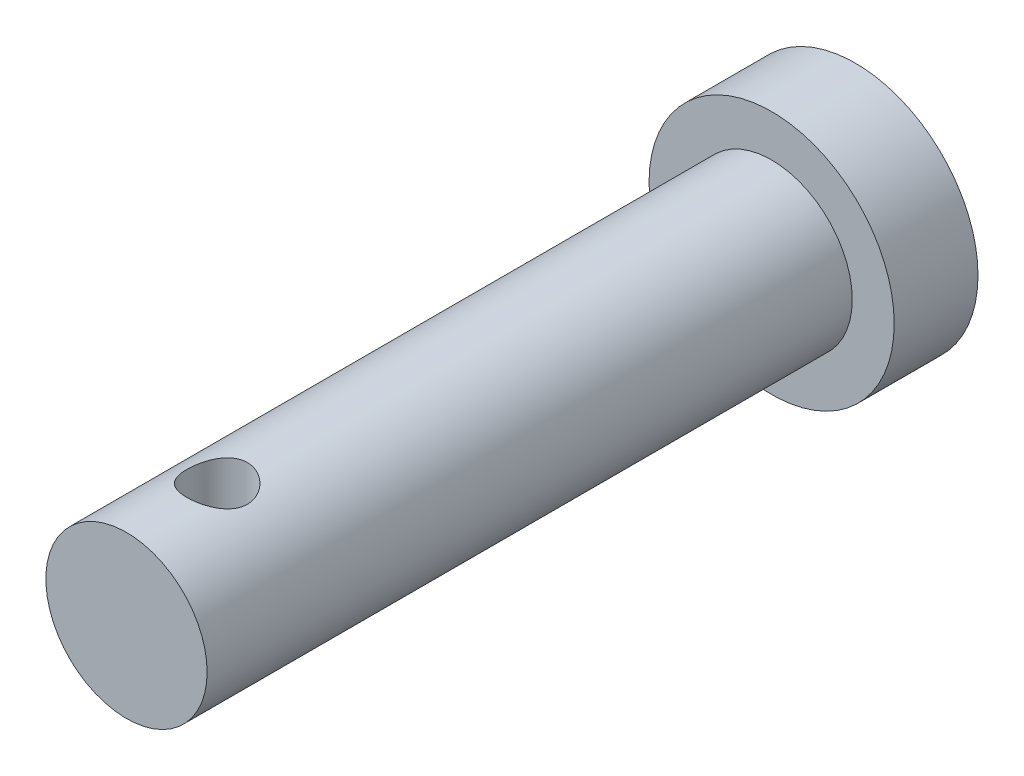
ISO-10303-21;
HEADER;
FILE_DESCRIPTION(('STEP AP214'),'2;1');
FILE_NAME('part.step','',(''),(''),'','','');
FILE_SCHEMA(('AUTOMOTIVE_DESIGN { 1 0 10303 214 1 1 1 1 }'));
ENDSEC;
DATA;
#1=APPLICATION_CONTEXT('core data for automotive mechanical design processes');
#2=APPLICATION_PROTOCOL_DEFINITION('international standard','automotive_design',2000,#1);
#3=PRODUCT_CONTEXT('',#1,'mechanical');
#4=PRODUCT('Part','Part','',(#3));
#5=PRODUCT_RELATED_PRODUCT_CATEGORY('part','',(#4));
#6=PRODUCT_DEFINITION_FORMATION('','',#4);
#7=PRODUCT_DEFINITION_CONTEXT('part definition',#1,'design');
#8=PRODUCT_DEFINITION('design','',#6,#7);
#9=PRODUCT_DEFINITION_SHAPE('','',#8);
#10=(LENGTH_UNIT() NAMED_UNIT(*) SI_UNIT(.MILLI.,.METRE.));
#11=(NAMED_UNIT(*) PLANE_ANGLE_UNIT() SI_UNIT($,.RADIAN.));
#12=(NAMED_UNIT(*) SI_UNIT($,.STERADIAN.) SOLID_ANGLE_UNIT());
#13=UNCERTAINTY_MEASURE_WITH_UNIT(LENGTH_MEASURE(1.E-05),#10,'distance_accuracy_value','');
#14=(GEOMETRIC_REPRESENTATION_CONTEXT(3) GLOBAL_UNCERTAINTY_ASSIGNED_CONTEXT((#13)) GLOBAL_UNIT_ASSIGNED_CONTEXT((#10,
#11,#12)) REPRESENTATION_CONTEXT('',''));
#15=CARTESIAN_POINT('',(0.,0.,0.));
#16=DIRECTION('',(0.,0.,1.));
#17=DIRECTION('',(1.,0.,0.));
#18=AXIS2_PLACEMENT_3D('',#15,#16,#17);
#19=CARTESIAN_POINT('',(0.,0.,28.7));
#20=DIRECTION('',(0.,0.,-1.));
#21=DIRECTION('',(-1.,0.,0.));
#22=AXIS2_PLACEMENT_3D('',#19,#20,#21);
#23=CYLINDRICAL_SURFACE('',#22,3.175);
#24=CARTESIAN_POINT('',(0.,0.,28.7));
#25=DIRECTION('',(0.,0.,1.));
#26=DIRECTION('',(1.,0.,0.));
#27=AXIS2_PLACEMENT_3D('',#24,#25,#26);
#28=CIRCLE('',#27,3.175);
#29=CARTESIAN_POINT('',(3.175,0.,28.7));
#30=VERTEX_POINT('',#29);
#31=EDGE_CURVE('E57',#30,#30,#28,.T.);
#32=ORIENTED_EDGE('',*,*,#31,.F.);
#33=EDGE_LOOP('',(#32));
#34=FACE_BOUND('',#33,.T.);
#35=CARTESIAN_POINT('',(0.,0.,3.3));
#36=DIRECTION('',(0.,0.,1.));
#37=DIRECTION('',(1.,0.,0.));
#38=AXIS2_PLACEMENT_3D('',#35,#36,#37);
#39=CIRCLE('',#38,3.175);
#40=CARTESIAN_POINT('',(3.175,0.,3.3));
#41=VERTEX_POINT('',#40);
#42=EDGE_CURVE('E10',#41,#41,#39,.T.);
#43=ORIENTED_EDGE('',*,*,#42,.T.);
#44=EDGE_LOOP('',(#43));
#45=FACE_BOUND('',#44,.T.);
#46=CARTESIAN_POINT('',(0.,-3.175,23.939375));
#47=CARTESIAN_POINT('',(0.0644803280319206,-3.1750017260582,23.9393726962969));
#48=CARTESIAN_POINT('',(0.128944879414297,-3.17301863556027,23.9446294346972));
#49=CARTESIAN_POINT('',(0.255947427804686,-3.16530589955499,23.9654323799955));
#50=CARTESIAN_POINT('',(0.318485700965169,-3.15957679372107,23.9809771047485));
#51=CARTESIAN_POINT('',(0.439785748086508,-3.14498698210789,24.0217289451563));
#52=CARTESIAN_POINT('',(0.498554552928805,-3.13613231952368,24.0469174227273));
#53=CARTESIAN_POINT('',(0.611028202439699,-3.11617334413749,24.1061469653313));
#54=CARTESIAN_POINT('',(0.66473168359744,-3.10506842811866,24.1401904047757));
#55=CARTESIAN_POINT('',(0.767831218530123,-3.08122833533403,24.2176736965375));
#56=CARTESIAN_POINT('',(0.816983642057507,-3.06844702050705,24.2614233956684));
#57=CARTESIAN_POINT('',(0.907450095452756,-3.04292175316616,24.3564195325105));
#58=CARTESIAN_POINT('',(0.948761726101169,-3.03017781325932,24.4076682563948));
#59=CARTESIAN_POINT('',(1.02392323008938,-3.00563336052824,24.5185882398466));
#60=CARTESIAN_POINT('',(1.05742893349134,-2.99388727501525,24.5785059659457));
#61=CARTESIAN_POINT('',(1.11377925527679,-2.97338639063463,24.7036358811213));
#62=CARTESIAN_POINT('',(1.13662813187983,-2.96463039737106,24.7688459432544));
#63=CARTESIAN_POINT('',(1.17005442120179,-2.95159440179158,24.8999051625799));
#64=CARTESIAN_POINT('',(1.1810967711723,-2.94714552453477,24.9656183742581));
#65=CARTESIAN_POINT('',(1.19205022996995,-2.94273336284839,25.0981040754076));
#66=CARTESIAN_POINT('',(1.19196593587088,-2.94276822592073,25.1648761160129));
#67=CARTESIAN_POINT('',(1.18102403502952,-2.94717399857943,25.2933295606378));
#68=CARTESIAN_POINT('',(1.17081148004021,-2.95128528416453,25.3550764691726));
#69=CARTESIAN_POINT('',(1.14096933245487,-2.96294919584752,25.4759060506342));
#70=CARTESIAN_POINT('',(1.12133832170211,-2.97050234018473,25.5349883208748));
#71=CARTESIAN_POINT('',(1.07286225428949,-2.98835526113513,25.6501261725093));
#72=CARTESIAN_POINT('',(1.04384989935073,-2.99870429903107,25.7061033421088));
#73=CARTESIAN_POINT('',(0.977551335491411,-3.02096654298085,25.8125819292128));
#74=CARTESIAN_POINT('',(0.940262269910615,-3.03288028850369,25.8630814471563));
#75=CARTESIAN_POINT('',(0.85551788483448,-3.05790630844421,25.9607416580229));
#76=CARTESIAN_POINT('',(0.807547746065833,-3.07104532042939,26.0074498585938));
#77=CARTESIAN_POINT('',(0.704304368962596,-3.09635309230243,26.0922932606759));
#78=CARTESIAN_POINT('',(0.649030010276032,-3.10852170288599,26.1304271445933));
#79=CARTESIAN_POINT('',(0.531592978112733,-3.13075950879707,26.1975385026684));
#80=CARTESIAN_POINT('',(0.469337004114246,-3.1407933299357,26.2263652675942));
#81=CARTESIAN_POINT('',(0.340389250103888,-3.15736857672026,26.2729861921393));
#82=CARTESIAN_POINT('',(0.273699454858827,-3.1639115533356,26.2907852518954));
#83=CARTESIAN_POINT('',(0.141585349249252,-3.17249526812277,26.3139755876114));
#84=CARTESIAN_POINT('',(0.0762822480275036,-3.17475686664138,26.3199761938161));
#85=CARTESIAN_POINT('',(-0.054429402233675,-3.17520553124475,26.3211735319706));
#86=CARTESIAN_POINT('',(-0.119837924680551,-3.17339350069573,26.3163726592514));
#87=CARTESIAN_POINT('',(-0.246270501045975,-3.16604419632035,26.2965664039175));
#88=CARTESIAN_POINT('',(-0.307366454105821,-3.16065273826329,26.2819602121587));
#89=CARTESIAN_POINT('',(-0.426197517997293,-3.1468335994155,26.2434835549156));
#90=CARTESIAN_POINT('',(-0.483932190588354,-3.13840552373861,26.2196118845037));
#91=CARTESIAN_POINT('',(-0.596302913556185,-3.11903764373597,26.1625207851262));
#92=CARTESIAN_POINT('',(-0.650798072574,-3.1080313141617,26.1290473024289));
#93=CARTESIAN_POINT('',(-0.753580464933009,-3.08472420554452,26.0539900056076));
#94=CARTESIAN_POINT('',(-0.80186539546467,-3.07242294938803,26.0124031972923));
#95=CARTESIAN_POINT('',(-0.893786946503479,-3.04699455283473,25.9194604780639));
#96=CARTESIAN_POINT('',(-0.936991348355823,-3.03386090349835,25.8676777674242));
#97=CARTESIAN_POINT('',(-1.01418270962823,-3.00893809999065,25.7573392133883));
#98=CARTESIAN_POINT('',(-1.04816884135274,-2.99714906660555,25.6987827624604));
#99=CARTESIAN_POINT('',(-1.10599357730704,-2.9762992117158,25.5760748104995));
#100=CARTESIAN_POINT('',(-1.12978950323491,-2.96724991010742,25.5119011079336));
#101=CARTESIAN_POINT('',(-1.16608132501843,-2.95317888607235,25.3800235000728));
#102=CARTESIAN_POINT('',(-1.17858421180018,-2.94815467214383,25.3123218062677));
#103=CARTESIAN_POINT('',(-1.1913103800891,-2.94303366491605,25.1799934233642));
#104=CARTESIAN_POINT('',(-1.19227069374821,-2.94264115340402,25.1154484735747));
#105=CARTESIAN_POINT('',(-1.18377268040514,-2.94606990116576,24.9871684052058));
#106=CARTESIAN_POINT('',(-1.17431534131035,-2.94989076088501,24.9234332104169));
#107=CARTESIAN_POINT('',(-1.14582428656504,-2.96106962383437,24.8005562637937));
#108=CARTESIAN_POINT('',(-1.12709164913741,-2.96831611517726,24.7413336876678));
#109=CARTESIAN_POINT('',(-1.08084696819061,-2.98546478961414,24.6268375026326));
#110=CARTESIAN_POINT('',(-1.0533327052505,-2.99536764396202,24.5715648963443));
#111=CARTESIAN_POINT('',(-0.988632102759095,-3.01735905848772,24.4633874856775));
#112=CARTESIAN_POINT('',(-0.951014360373894,-3.02953498137515,24.4107586800401));
#113=CARTESIAN_POINT('',(-0.867842480481129,-3.05439958363509,24.3123251359791));
#114=CARTESIAN_POINT('',(-0.822285820601665,-3.06708842498621,24.266522575013));
#115=CARTESIAN_POINT('',(-0.721582564947793,-3.09237399534093,24.1805146975664));
#116=CARTESIAN_POINT('',(-0.666050423844061,-3.10492858264887,24.1407463957112));
#117=CARTESIAN_POINT('',(-0.548650495915651,-3.12780770850268,24.0711195173742));
#118=CARTESIAN_POINT('',(-0.48678221643443,-3.13813207344675,24.0412617122343));
#119=CARTESIAN_POINT('',(-0.355599271339335,-3.15574594756552,23.9914633919429));
#120=CARTESIAN_POINT('',(-0.286078153898403,-3.16288465369445,23.9720083924722));
#121=CARTESIAN_POINT('',(-0.144363863550066,-3.17250954730047,23.945968713063));
#122=CARTESIAN_POINT('',(-0.072172049239607,-3.17499806804399,23.9393775785069));
#123=CARTESIAN_POINT('',(0.,-3.175,23.939375));
#124=B_SPLINE_CURVE_WITH_KNOTS('',3,(#46,#47,#48,#49,#50,#51,#52,#53,#54,#55,#56,#57,#58,#59,
#60,#61,#62,#63,#64,#65,#66,#67,#68,#69,#70,#71,#72,#73,#74,#75,#76,#77,#78,#79,#80,#81,#82,#83,
#84,#85,#86,#87,#88,#89,#90,#91,#92,#93,#94,#95,#96,#97,#98,#99,#100,#101,#102,#103,#104,#105,
#106,#107,#108,#109,#110,#111,#112,#113,#114,#115,#116,#117,#118,#119,#120,#121,#122,#123),
.UNSPECIFIED.,.T.,.F.,(4,2,2,2,2,2,2,2,2,2,2,2,2,2,2,2,2,2,2,2,2,2,2,2,2,2,2,2,2,2,2,2,2,2,2,2,
2,2,4),(0.,0.193174779988694,0.386321736189802,0.57909727431327,0.771924557565031,
0.972134347500301,1.17240530159712,1.38030485385691,1.58812126298256,1.78741287818415,
1.98662215450767,2.17390936438977,2.36122478335592,2.55208411657196,2.74300942653255,
2.94676634210301,3.15055454712146,3.35749404133322,3.56434151635958,3.76019234336015,
3.95599974284975,4.14428335102047,4.33259145270722,4.52643257351057,4.7203453664077,
4.92550862317928,5.13069029517861,5.33672309214718,5.54262825746727,5.7353101851245,
5.92797384230186,6.1147574430106,6.30158828783601,6.49821274558139,6.69489978960167,
6.90223036662893,7.10957707657799,7.32590383806683,7.54212202675675),.UNSPECIFIED.);
#125=CARTESIAN_POINT('',(0.,-3.175,23.939375));
#126=VERTEX_POINT('',#125);
#127=EDGE_CURVE('E60',#126,#126,#124,.T.);
#128=ORIENTED_EDGE('',*,*,#127,.F.);
#129=EDGE_LOOP('',(#128));
#130=FACE_BOUND('',#129,.T.);
#131=CARTESIAN_POINT('',(0.,3.175,23.939375));
#132=CARTESIAN_POINT('',(-0.0644803280319206,3.1750017260582,23.9393726962969));
#133=CARTESIAN_POINT('',(-0.128944879414297,3.17301863556027,23.9446294346972));
#134=CARTESIAN_POINT('',(-0.255947427804686,3.16530589955499,23.9654323799955));
#135=CARTESIAN_POINT('',(-0.318485700965169,3.15957679372107,23.9809771047485));
#136=CARTESIAN_POINT('',(-0.439785748086508,3.14498698210789,24.0217289451563));
#137=CARTESIAN_POINT('',(-0.498554552928805,3.13613231952368,24.0469174227273));
#138=CARTESIAN_POINT('',(-0.611028202439699,3.11617334413749,24.1061469653313));
#139=CARTESIAN_POINT('',(-0.66473168359744,3.10506842811866,24.1401904047757));
#140=CARTESIAN_POINT('',(-0.767831218530123,3.08122833533403,24.2176736965375));
#141=CARTESIAN_POINT('',(-0.816983642057507,3.06844702050705,24.2614233956684));
#142=CARTESIAN_POINT('',(-0.907450095452756,3.04292175316616,24.3564195325105));
#143=CARTESIAN_POINT('',(-0.948761726101169,3.03017781325932,24.4076682563948));
#144=CARTESIAN_POINT('',(-1.02392323008938,3.00563336052824,24.5185882398466));
#145=CARTESIAN_POINT('',(-1.05742893349134,2.99388727501525,24.5785059659457));
#146=CARTESIAN_POINT('',(-1.11377925527679,2.97338639063463,24.7036358811213));
#147=CARTESIAN_POINT('',(-1.13662813187983,2.96463039737106,24.7688459432544));
#148=CARTESIAN_POINT('',(-1.17005442120179,2.95159440179158,24.8999051625799));
#149=CARTESIAN_POINT('',(-1.1810967711723,2.94714552453477,24.9656183742581));
#150=CARTESIAN_POINT('',(-1.19205022996995,2.94273336284839,25.0981040754076));
#151=CARTESIAN_POINT('',(-1.19196593587088,2.94276822592073,25.1648761160129));
#152=CARTESIAN_POINT('',(-1.18102403502952,2.94717399857943,25.2933295606378));
#153=CARTESIAN_POINT('',(-1.17081148004021,2.95128528416453,25.3550764691726));
#154=CARTESIAN_POINT('',(-1.14096933245487,2.96294919584752,25.4759060506342));
#155=CARTESIAN_POINT('',(-1.12133832170211,2.97050234018473,25.5349883208748));
#156=CARTESIAN_POINT('',(-1.07286225428949,2.98835526113513,25.6501261725093));
#157=CARTESIAN_POINT('',(-1.04384989935073,2.99870429903107,25.7061033421088));
#158=CARTESIAN_POINT('',(-0.977551335491411,3.02096654298085,25.8125819292128));
#159=CARTESIAN_POINT('',(-0.940262269910615,3.03288028850369,25.8630814471563));
#160=CARTESIAN_POINT('',(-0.85551788483448,3.05790630844421,25.9607416580229));
#161=CARTESIAN_POINT('',(-0.807547746065833,3.07104532042939,26.0074498585938));
#162=CARTESIAN_POINT('',(-0.704304368962596,3.09635309230243,26.0922932606759));
#163=CARTESIAN_POINT('',(-0.649030010276032,3.10852170288599,26.1304271445933));
#164=CARTESIAN_POINT('',(-0.531592978112733,3.13075950879707,26.1975385026684));
#165=CARTESIAN_POINT('',(-0.469337004114246,3.1407933299357,26.2263652675942));
#166=CARTESIAN_POINT('',(-0.340389250103888,3.15736857672026,26.2729861921393));
#167=CARTESIAN_POINT('',(-0.273699454858827,3.1639115533356,26.2907852518954));
#168=CARTESIAN_POINT('',(-0.141585349249252,3.17249526812277,26.3139755876114));
#169=CARTESIAN_POINT('',(-0.0762822480275036,3.17475686664138,26.3199761938161));
#170=CARTESIAN_POINT('',(0.054429402233675,3.17520553124475,26.3211735319706));
#171=CARTESIAN_POINT('',(0.119837924680551,3.17339350069573,26.3163726592514));
#172=CARTESIAN_POINT('',(0.246270501045975,3.16604419632035,26.2965664039175));
#173=CARTESIAN_POINT('',(0.307366454105821,3.16065273826329,26.2819602121587));
#174=CARTESIAN_POINT('',(0.426197517997293,3.1468335994155,26.2434835549156));
#175=CARTESIAN_POINT('',(0.483932190588354,3.13840552373861,26.2196118845037));
#176=CARTESIAN_POINT('',(0.596302913556185,3.11903764373597,26.1625207851262));
#177=CARTESIAN_POINT('',(0.650798072574,3.1080313141617,26.1290473024289));
#178=CARTESIAN_POINT('',(0.753580464933009,3.08472420554452,26.0539900056076));
#179=CARTESIAN_POINT('',(0.80186539546467,3.07242294938803,26.0124031972923));
#180=CARTESIAN_POINT('',(0.893786946503479,3.04699455283473,25.9194604780639));
#181=CARTESIAN_POINT('',(0.936991348355823,3.03386090349835,25.8676777674242));
#182=CARTESIAN_POINT('',(1.01418270962823,3.00893809999065,25.7573392133883));
#183=CARTESIAN_POINT('',(1.04816884135274,2.99714906660555,25.6987827624604));
#184=CARTESIAN_POINT('',(1.10599357730704,2.9762992117158,25.5760748104995));
#185=CARTESIAN_POINT('',(1.12978950323491,2.96724991010742,25.5119011079336));
#186=CARTESIAN_POINT('',(1.16608132501843,2.95317888607235,25.3800235000728));
#187=CARTESIAN_POINT('',(1.17858421180018,2.94815467214383,25.3123218062677));
#188=CARTESIAN_POINT('',(1.1913103800891,2.94303366491605,25.1799934233642));
#189=CARTESIAN_POINT('',(1.19227069374821,2.94264115340402,25.1154484735747));
#190=CARTESIAN_POINT('',(1.18377268040514,2.94606990116576,24.9871684052058));
#191=CARTESIAN_POINT('',(1.17431534131035,2.94989076088501,24.9234332104169));
#192=CARTESIAN_POINT('',(1.14582428656504,2.96106962383437,24.8005562637937));
#193=CARTESIAN_POINT('',(1.12709164913741,2.96831611517726,24.7413336876678));
#194=CARTESIAN_POINT('',(1.08084696819061,2.98546478961414,24.6268375026326));
#195=CARTESIAN_POINT('',(1.0533327052505,2.99536764396202,24.5715648963443));
#196=CARTESIAN_POINT('',(0.988632102759095,3.01735905848772,24.4633874856775));
#197=CARTESIAN_POINT('',(0.951014360373894,3.02953498137515,24.4107586800401));
#198=CARTESIAN_POINT('',(0.867842480481129,3.05439958363509,24.3123251359791));
#199=CARTESIAN_POINT('',(0.822285820601665,3.06708842498621,24.266522575013));
#200=CARTESIAN_POINT('',(0.721582564947793,3.09237399534093,24.1805146975664));
#201=CARTESIAN_POINT('',(0.666050423844061,3.10492858264887,24.1407463957112));
#202=CARTESIAN_POINT('',(0.548650495915651,3.12780770850268,24.0711195173742));
#203=CARTESIAN_POINT('',(0.48678221643443,3.13813207344675,24.0412617122343));
#204=CARTESIAN_POINT('',(0.355599271339335,3.15574594756552,23.9914633919429));
#205=CARTESIAN_POINT('',(0.286078153898403,3.16288465369445,23.9720083924722));
#206=CARTESIAN_POINT('',(0.144363863550066,3.17250954730047,23.945968713063));
#207=CARTESIAN_POINT('',(0.072172049239607,3.17499806804399,23.9393775785069));
#208=CARTESIAN_POINT('',(0.,3.175,23.939375));
#209=B_SPLINE_CURVE_WITH_KNOTS('',3,(#131,#132,#133,#134,#135,#136,#137,#138,#139,#140,#141,
#142,#143,#144,#145,#146,#147,#148,#149,#150,#151,#152,#153,#154,#155,#156,#157,#158,#159,#160,
#161,#162,#163,#164,#165,#166,#167,#168,#169,#170,#171,#172,#173,#174,#175,#176,#177,#178,#179,
#180,#181,#182,#183,#184,#185,#186,#187,#188,#189,#190,#191,#192,#193,#194,#195,#196,#197,#198,
#199,#200,#201,#202,#203,#204,#205,#206,#207,#208),.UNSPECIFIED.,.T.,.F.,(4,2,2,2,2,2,2,2,2,2,2,
2,2,2,2,2,2,2,2,2,2,2,2,2,2,2,2,2,2,2,2,2,2,2,2,2,2,2,4),(0.,0.193174779988694,
0.386321736189802,0.57909727431327,0.771924557565031,0.972134347500301,1.17240530159712,
1.38030485385691,1.58812126298256,1.78741287818415,1.98662215450767,2.17390936438977,
2.36122478335592,2.55208411657196,2.74300942653255,2.94676634210301,3.15055454712146,
3.35749404133322,3.56434151635958,3.76019234336015,3.95599974284975,4.14428335102047,
4.33259145270722,4.52643257351057,4.7203453664077,4.92550862317928,5.13069029517861,
5.33672309214718,5.54262825746727,5.7353101851245,5.92797384230186,6.1147574430106,
6.30158828783601,6.49821274558139,6.69489978960167,6.90223036662893,7.10957707657799,
7.32590383806683,7.54212202675675),.UNSPECIFIED.);
#210=CARTESIAN_POINT('',(0.,3.175,23.939375));
#211=VERTEX_POINT('',#210);
#212=EDGE_CURVE('E40',#211,#211,#209,.T.);
#213=ORIENTED_EDGE('',*,*,#212,.F.);
#214=EDGE_LOOP('',(#213));
#215=FACE_BOUND('',#214,.T.);
#216=ADVANCED_FACE('F36',(#34,#45,#130,#215),#23,.T.);
#217=CARTESIAN_POINT('',(0.,0.,3.3));
#218=DIRECTION('',(0.,0.,-1.));
#219=DIRECTION('',(-1.,0.,0.));
#220=AXIS2_PLACEMENT_3D('',#217,#218,#219);
#221=CYLINDRICAL_SURFACE('',#220,4.826);
#222=CARTESIAN_POINT('',(0.,0.,3.3));
#223=DIRECTION('',(0.,0.,1.));
#224=DIRECTION('',(1.,0.,0.));
#225=AXIS2_PLACEMENT_3D('',#222,#223,#224);
#226=CIRCLE('',#225,4.826);
#227=CARTESIAN_POINT('',(4.826,0.,3.3));
#228=VERTEX_POINT('',#227);
#229=EDGE_CURVE('E49',#228,#228,#226,.T.);
#230=ORIENTED_EDGE('',*,*,#229,.F.);
#231=EDGE_LOOP('',(#230));
#232=FACE_BOUND('',#231,.T.);
#233=CARTESIAN_POINT('',(0.,0.,0.));
#234=DIRECTION('',(0.,0.,1.));
#235=DIRECTION('',(1.,0.,0.));
#236=AXIS2_PLACEMENT_3D('',#233,#234,#235);
#237=CIRCLE('',#236,4.826);
#238=CARTESIAN_POINT('',(4.826,0.,0.));
#239=VERTEX_POINT('',#238);
#240=EDGE_CURVE('E54',#239,#239,#237,.T.);
#241=ORIENTED_EDGE('',*,*,#240,.T.);
#242=EDGE_LOOP('',(#241));
#243=FACE_BOUND('',#242,.T.);
#244=ADVANCED_FACE('F38',(#232,#243),#221,.T.);
#245=CARTESIAN_POINT('',(0.,0.,3.3));
#246=DIRECTION('',(0.,0.,1.));
#247=DIRECTION('',(1.,0.,0.));
#248=AXIS2_PLACEMENT_3D('',#245,#246,#247);
#249=PLANE('',#248);
#250=ORIENTED_EDGE('',*,*,#42,.F.);
#251=EDGE_LOOP('',(#250));
#252=FACE_BOUND('',#251,.T.);
#253=ORIENTED_EDGE('',*,*,#229,.T.);
#254=EDGE_LOOP('',(#253));
#255=FACE_BOUND('',#254,.T.);
#256=ADVANCED_FACE('F80',(#252,#255),#249,.T.);
#257=CARTESIAN_POINT('',(0.,0.,0.));
#258=DIRECTION('',(0.,0.,1.));
#259=DIRECTION('',(1.,0.,0.));
#260=AXIS2_PLACEMENT_3D('',#257,#258,#259);
#261=PLANE('',#260);
#262=ORIENTED_EDGE('',*,*,#240,.F.);
#263=EDGE_LOOP('',(#262));
#264=FACE_BOUND('',#263,.T.);
#265=ADVANCED_FACE('F75',(#264),#261,.F.);
#266=CARTESIAN_POINT('',(0.,0.,28.7));
#267=DIRECTION('',(0.,0.,1.));
#268=DIRECTION('',(1.,0.,0.));
#269=AXIS2_PLACEMENT_3D('',#266,#267,#268);
#270=PLANE('',#269);
#271=ORIENTED_EDGE('',*,*,#31,.T.);
#272=EDGE_LOOP('',(#271));
#273=FACE_BOUND('',#272,.T.);
#274=ADVANCED_FACE('F71',(#273),#270,.T.);
#275=CARTESIAN_POINT('',(0.,10.,25.13));
#276=DIRECTION('',(0.,-1.,0.));
#277=DIRECTION('',(0.,0.,-1.));
#278=AXIS2_PLACEMENT_3D('',#275,#276,#277);
#279=CYLINDRICAL_SURFACE('',#278,1.190625);
#280=ORIENTED_EDGE('',*,*,#127,.T.);
#281=EDGE_LOOP('',(#280));
#282=FACE_BOUND('',#281,.T.);
#283=ORIENTED_EDGE('',*,*,#212,.T.);
#284=EDGE_LOOP('',(#283));
#285=FACE_BOUND('',#284,.T.);
#286=ADVANCED_FACE('F68',(#282,#285),#279,.F.);
#287=CLOSED_SHELL('',(#216,#244,#256,#265,#274,#286));
#288=MANIFOLD_SOLID_BREP('B2',#287);
#289=ADVANCED_BREP_SHAPE_REPRESENTATION('',(#18,#288),#14);
#290=SHAPE_DEFINITION_REPRESENTATION(#9,#289);
ENDSEC;
END-ISO-10303-21;
